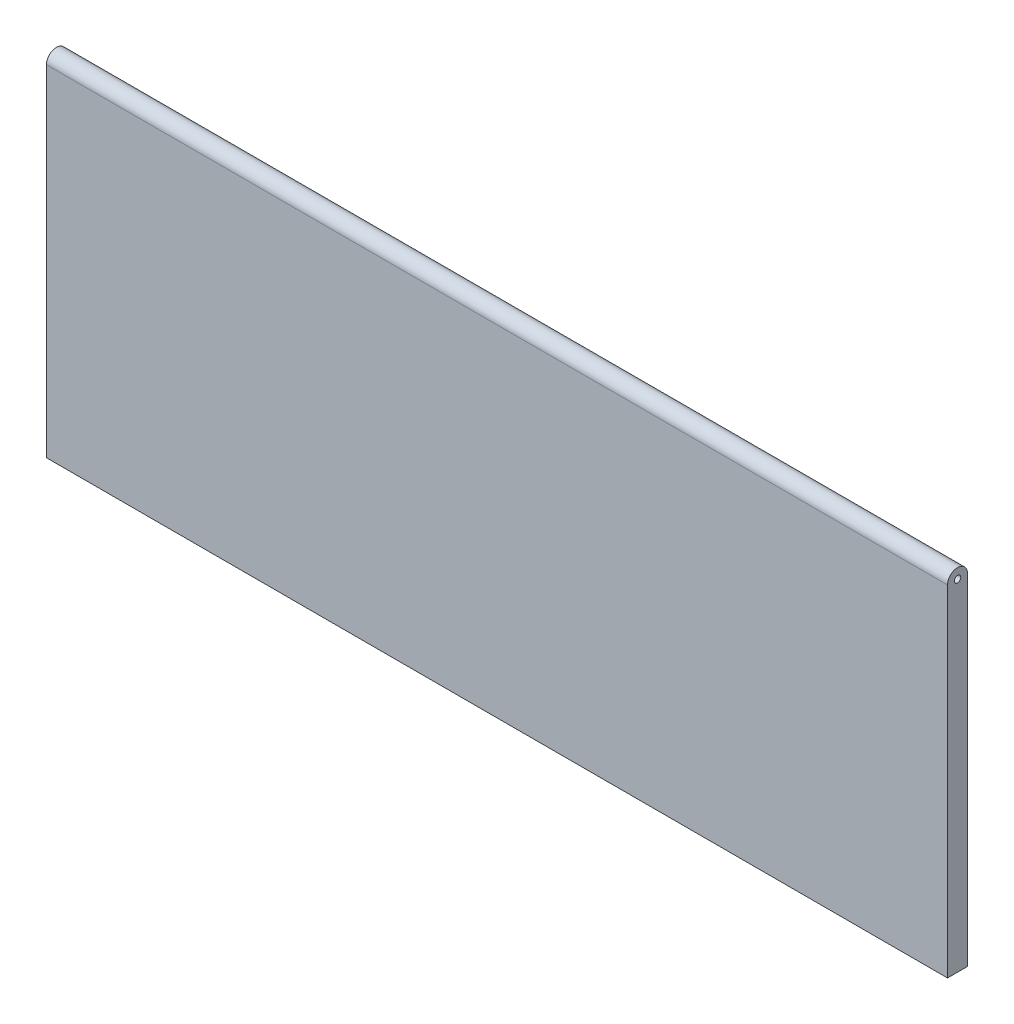
ISO-10303-21;
HEADER;
FILE_DESCRIPTION(('STEP AP214'),'2;1');
FILE_NAME('part.step','',(''),(''),'','','');
FILE_SCHEMA(('AUTOMOTIVE_DESIGN { 1 0 10303 214 1 1 1 1 }'));
ENDSEC;
DATA;
#1=APPLICATION_CONTEXT('core data for automotive mechanical design processes');
#2=APPLICATION_PROTOCOL_DEFINITION('international standard','automotive_design',2000,#1);
#3=PRODUCT_CONTEXT('',#1,'mechanical');
#4=PRODUCT('Part','Part','',(#3));
#5=PRODUCT_RELATED_PRODUCT_CATEGORY('part','',(#4));
#6=PRODUCT_DEFINITION_FORMATION('','',#4);
#7=PRODUCT_DEFINITION_CONTEXT('part definition',#1,'design');
#8=PRODUCT_DEFINITION('design','',#6,#7);
#9=PRODUCT_DEFINITION_SHAPE('','',#8);
#10=(LENGTH_UNIT() NAMED_UNIT(*) SI_UNIT(.MILLI.,.METRE.));
#11=(NAMED_UNIT(*) PLANE_ANGLE_UNIT() SI_UNIT($,.RADIAN.));
#12=(NAMED_UNIT(*) SI_UNIT($,.STERADIAN.) SOLID_ANGLE_UNIT());
#13=UNCERTAINTY_MEASURE_WITH_UNIT(LENGTH_MEASURE(1.E-05),#10,'distance_accuracy_value','');
#14=(GEOMETRIC_REPRESENTATION_CONTEXT(3) GLOBAL_UNCERTAINTY_ASSIGNED_CONTEXT((#13)) GLOBAL_UNIT_ASSIGNED_CONTEXT((#10,
#11,#12)) REPRESENTATION_CONTEXT('',''));
#15=CARTESIAN_POINT('',(0.,0.,0.));
#16=DIRECTION('',(0.,0.,1.));
#17=DIRECTION('',(1.,0.,0.));
#18=AXIS2_PLACEMENT_3D('',#15,#16,#17);
#19=CARTESIAN_POINT('',(228.6,41.91,0.));
#20=DIRECTION('',(-1.,0.,0.));
#21=DIRECTION('',(0.,0.,1.));
#22=AXIS2_PLACEMENT_3D('',#19,#20,#21);
#23=PLANE('',#22);
#24=DIRECTION('',(0.,-1.,0.));
#25=VECTOR('',#24,1.);
#26=CARTESIAN_POINT('',(228.6,-44.45,2.54));
#27=LINE('',#26,#25);
#28=CARTESIAN_POINT('',(228.6,41.91,2.54));
#29=VERTEX_POINT('',#28);
#30=CARTESIAN_POINT('',(228.6,-44.45,2.54));
#31=VERTEX_POINT('',#30);
#32=EDGE_CURVE('E96',#29,#31,#27,.T.);
#33=ORIENTED_EDGE('',*,*,#32,.T.);
#34=DIRECTION('',(0.,0.,-1.));
#35=VECTOR('',#34,1.);
#36=CARTESIAN_POINT('',(228.6,-44.45,2.54));
#37=LINE('',#36,#35);
#38=CARTESIAN_POINT('',(228.6,-44.45,-2.54));
#39=VERTEX_POINT('',#38);
#40=EDGE_CURVE('E91',#31,#39,#37,.T.);
#41=ORIENTED_EDGE('',*,*,#40,.T.);
#42=DIRECTION('',(0.,1.,0.));
#43=VECTOR('',#42,1.);
#44=CARTESIAN_POINT('',(228.6,-44.45,-2.54));
#45=LINE('',#44,#43);
#46=CARTESIAN_POINT('',(228.6,41.91,-2.54));
#47=VERTEX_POINT('',#46);
#48=EDGE_CURVE('E94',#39,#47,#45,.T.);
#49=ORIENTED_EDGE('',*,*,#48,.T.);
#50=CARTESIAN_POINT('',(228.6,41.91,0.));
#51=DIRECTION('',(1.,0.,0.));
#52=DIRECTION('',(0.,0.,1.));
#53=AXIS2_PLACEMENT_3D('',#50,#51,#52);
#54=CIRCLE('',#53,2.54);
#55=EDGE_CURVE('E61',#47,#29,#54,.T.);
#56=ORIENTED_EDGE('',*,*,#55,.T.);
#57=EDGE_LOOP('',(#33,#41,#49,#56));
#58=FACE_BOUND('',#57,.T.);
#59=CARTESIAN_POINT('',(228.6,41.91,0.));
#60=DIRECTION('',(1.,0.,0.));
#61=DIRECTION('',(0.,0.,-1.));
#62=AXIS2_PLACEMENT_3D('',#59,#60,#61);
#63=CIRCLE('',#62,0.8255);
#64=CARTESIAN_POINT('',(228.6,41.91,-0.8255));
#65=VERTEX_POINT('',#64);
#66=EDGE_CURVE('E116',#65,#65,#63,.T.);
#67=ORIENTED_EDGE('',*,*,#66,.F.);
#68=EDGE_LOOP('',(#67));
#69=FACE_BOUND('',#68,.T.);
#70=ADVANCED_FACE('F43',(#58,#69),#23,.F.);
#71=CARTESIAN_POINT('',(0.,41.91,0.));
#72=DIRECTION('',(-1.,0.,0.));
#73=DIRECTION('',(0.,0.,1.));
#74=AXIS2_PLACEMENT_3D('',#71,#72,#73);
#75=PLANE('',#74);
#76=DIRECTION('',(0.,-1.,0.));
#77=VECTOR('',#76,1.);
#78=CARTESIAN_POINT('',(0.,-44.45,2.54));
#79=LINE('',#78,#77);
#80=CARTESIAN_POINT('',(0.,41.91,2.54));
#81=VERTEX_POINT('',#80);
#82=CARTESIAN_POINT('',(0.,-44.45,2.54));
#83=VERTEX_POINT('',#82);
#84=EDGE_CURVE('E112',#81,#83,#79,.T.);
#85=ORIENTED_EDGE('',*,*,#84,.F.);
#86=CARTESIAN_POINT('',(0.,41.91,0.));
#87=DIRECTION('',(1.,0.,0.));
#88=DIRECTION('',(0.,0.,1.));
#89=AXIS2_PLACEMENT_3D('',#86,#87,#88);
#90=CIRCLE('',#89,2.54);
#91=CARTESIAN_POINT('',(0.,41.91,-2.54));
#92=VERTEX_POINT('',#91);
#93=EDGE_CURVE('E84',#92,#81,#90,.T.);
#94=ORIENTED_EDGE('',*,*,#93,.F.);
#95=DIRECTION('',(0.,1.,0.));
#96=VECTOR('',#95,1.);
#97=CARTESIAN_POINT('',(0.,-44.45,-2.54));
#98=LINE('',#97,#96);
#99=CARTESIAN_POINT('',(0.,-44.45,-2.54));
#100=VERTEX_POINT('',#99);
#101=EDGE_CURVE('E78',#100,#92,#98,.T.);
#102=ORIENTED_EDGE('',*,*,#101,.F.);
#103=DIRECTION('',(0.,0.,-1.));
#104=VECTOR('',#103,1.);
#105=CARTESIAN_POINT('',(0.,-44.45,2.54));
#106=LINE('',#105,#104);
#107=EDGE_CURVE('E101',#83,#100,#106,.T.);
#108=ORIENTED_EDGE('',*,*,#107,.F.);
#109=EDGE_LOOP('',(#85,#94,#102,#108));
#110=FACE_BOUND('',#109,.T.);
#111=CARTESIAN_POINT('',(0.,41.91,0.));
#112=DIRECTION('',(1.,0.,0.));
#113=DIRECTION('',(0.,0.,-1.));
#114=AXIS2_PLACEMENT_3D('',#111,#112,#113);
#115=CIRCLE('',#114,0.8255);
#116=CARTESIAN_POINT('',(0.,41.91,-0.8255));
#117=VERTEX_POINT('',#116);
#118=EDGE_CURVE('E134',#117,#117,#115,.T.);
#119=ORIENTED_EDGE('',*,*,#118,.T.);
#120=EDGE_LOOP('',(#119));
#121=FACE_BOUND('',#120,.T.);
#122=ADVANCED_FACE('F129',(#110,#121),#75,.T.);
#123=CARTESIAN_POINT('',(228.6,-44.45,2.54));
#124=DIRECTION('',(0.,0.,-1.));
#125=DIRECTION('',(-1.,0.,0.));
#126=AXIS2_PLACEMENT_3D('',#123,#124,#125);
#127=PLANE('',#126);
#128=ORIENTED_EDGE('',*,*,#84,.T.);
#129=DIRECTION('',(-1.,0.,0.));
#130=VECTOR('',#129,1.);
#131=CARTESIAN_POINT('',(228.6,-44.45,2.54));
#132=LINE('',#131,#130);
#133=EDGE_CURVE('E11',#31,#83,#132,.T.);
#134=ORIENTED_EDGE('',*,*,#133,.F.);
#135=ORIENTED_EDGE('',*,*,#32,.F.);
#136=DIRECTION('',(-1.,0.,0.));
#137=VECTOR('',#136,1.);
#138=CARTESIAN_POINT('',(228.6,41.91,2.54));
#139=LINE('',#138,#137);
#140=EDGE_CURVE('E108',#29,#81,#139,.T.);
#141=ORIENTED_EDGE('',*,*,#140,.T.);
#142=EDGE_LOOP('',(#128,#134,#135,#141));
#143=FACE_BOUND('',#142,.T.);
#144=ADVANCED_FACE('F45',(#143),#127,.F.);
#145=CARTESIAN_POINT('',(228.6,-44.45,2.54));
#146=DIRECTION('',(0.,1.,0.));
#147=DIRECTION('',(0.,0.,1.));
#148=AXIS2_PLACEMENT_3D('',#145,#146,#147);
#149=PLANE('',#148);
#150=ORIENTED_EDGE('',*,*,#107,.T.);
#151=DIRECTION('',(-1.,0.,0.));
#152=VECTOR('',#151,1.);
#153=CARTESIAN_POINT('',(228.6,-44.45,-2.54));
#154=LINE('',#153,#152);
#155=EDGE_CURVE('E53',#39,#100,#154,.T.);
#156=ORIENTED_EDGE('',*,*,#155,.F.);
#157=ORIENTED_EDGE('',*,*,#40,.F.);
#158=ORIENTED_EDGE('',*,*,#133,.T.);
#159=EDGE_LOOP('',(#150,#156,#157,#158));
#160=FACE_BOUND('',#159,.T.);
#161=ADVANCED_FACE('F100',(#160),#149,.F.);
#162=CARTESIAN_POINT('',(228.6,-44.45,-2.54));
#163=DIRECTION('',(0.,0.,1.));
#164=DIRECTION('',(1.,0.,0.));
#165=AXIS2_PLACEMENT_3D('',#162,#163,#164);
#166=PLANE('',#165);
#167=ORIENTED_EDGE('',*,*,#101,.T.);
#168=DIRECTION('',(-1.,0.,0.));
#169=VECTOR('',#168,1.);
#170=CARTESIAN_POINT('',(228.6,41.91,-2.54));
#171=LINE('',#170,#169);
#172=EDGE_CURVE('E103',#47,#92,#171,.T.);
#173=ORIENTED_EDGE('',*,*,#172,.F.);
#174=ORIENTED_EDGE('',*,*,#48,.F.);
#175=ORIENTED_EDGE('',*,*,#155,.T.);
#176=EDGE_LOOP('',(#167,#173,#174,#175));
#177=FACE_BOUND('',#176,.T.);
#178=ADVANCED_FACE('F104',(#177),#166,.F.);
#179=CARTESIAN_POINT('',(228.6,41.91,0.));
#180=DIRECTION('',(-1.,0.,0.));
#181=DIRECTION('',(0.,0.,1.));
#182=AXIS2_PLACEMENT_3D('',#179,#180,#181);
#183=CYLINDRICAL_SURFACE('',#182,2.54);
#184=ORIENTED_EDGE('',*,*,#93,.T.);
#185=ORIENTED_EDGE('',*,*,#140,.F.);
#186=ORIENTED_EDGE('',*,*,#55,.F.);
#187=ORIENTED_EDGE('',*,*,#172,.T.);
#188=EDGE_LOOP('',(#184,#185,#186,#187));
#189=FACE_BOUND('',#188,.T.);
#190=ADVANCED_FACE('F126',(#189),#183,.T.);
#191=CARTESIAN_POINT('',(228.6,41.91,0.));
#192=DIRECTION('',(-1.,0.,0.));
#193=DIRECTION('',(0.,0.,1.));
#194=AXIS2_PLACEMENT_3D('',#191,#192,#193);
#195=CYLINDRICAL_SURFACE('',#194,0.8255);
#196=ORIENTED_EDGE('',*,*,#66,.T.);
#197=EDGE_LOOP('',(#196));
#198=FACE_BOUND('',#197,.T.);
#199=ORIENTED_EDGE('',*,*,#118,.F.);
#200=EDGE_LOOP('',(#199));
#201=FACE_BOUND('',#200,.T.);
#202=ADVANCED_FACE('F142',(#198,#201),#195,.F.);
#203=CLOSED_SHELL('',(#70,#122,#144,#161,#178,#190,#202));
#204=MANIFOLD_SOLID_BREP('B2',#203);
#205=ADVANCED_BREP_SHAPE_REPRESENTATION('',(#18,#204),#14);
#206=SHAPE_DEFINITION_REPRESENTATION(#9,#205);
ENDSEC;
END-ISO-10303-21;
